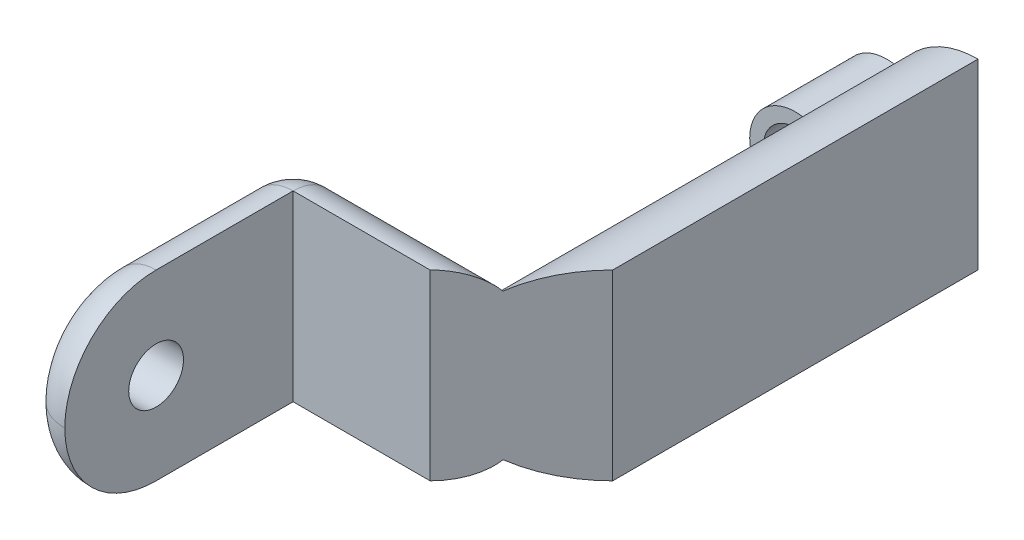
ISO-10303-21;
HEADER;
FILE_DESCRIPTION(('STEP AP214'),'2;1');
FILE_NAME('part.step','',(''),(''),'','','');
FILE_SCHEMA(('AUTOMOTIVE_DESIGN { 1 0 10303 214 1 1 1 1 }'));
ENDSEC;
DATA;
#1=APPLICATION_CONTEXT('core data for automotive mechanical design processes');
#2=APPLICATION_PROTOCOL_DEFINITION('international standard','automotive_design',2000,#1);
#3=PRODUCT_CONTEXT('',#1,'mechanical');
#4=PRODUCT('Part','Part','',(#3));
#5=PRODUCT_RELATED_PRODUCT_CATEGORY('part','',(#4));
#6=PRODUCT_DEFINITION_FORMATION('','',#4);
#7=PRODUCT_DEFINITION_CONTEXT('part definition',#1,'design');
#8=PRODUCT_DEFINITION('design','',#6,#7);
#9=PRODUCT_DEFINITION_SHAPE('','',#8);
#10=(LENGTH_UNIT() NAMED_UNIT(*) SI_UNIT(.MILLI.,.METRE.));
#11=(NAMED_UNIT(*) PLANE_ANGLE_UNIT() SI_UNIT($,.RADIAN.));
#12=(NAMED_UNIT(*) SI_UNIT($,.STERADIAN.) SOLID_ANGLE_UNIT());
#13=UNCERTAINTY_MEASURE_WITH_UNIT(LENGTH_MEASURE(1.E-05),#10,'distance_accuracy_value','');
#14=(GEOMETRIC_REPRESENTATION_CONTEXT(3) GLOBAL_UNCERTAINTY_ASSIGNED_CONTEXT((#13)) GLOBAL_UNIT_ASSIGNED_CONTEXT((#10,
#11,#12)) REPRESENTATION_CONTEXT('',''));
#15=CARTESIAN_POINT('',(0.,0.,0.));
#16=DIRECTION('',(0.,0.,1.));
#17=DIRECTION('',(1.,0.,0.));
#18=AXIS2_PLACEMENT_3D('',#15,#16,#17);
#19=CARTESIAN_POINT('',(10.,0.,-5.));
#20=DIRECTION('',(0.,0.,1.));
#21=DIRECTION('',(1.,0.,0.));
#22=AXIS2_PLACEMENT_3D('',#19,#20,#21);
#23=CYLINDRICAL_SURFACE('',#22,10.);
#24=DIRECTION('',(0.,0.,1.));
#25=VECTOR('',#24,1.);
#26=CARTESIAN_POINT('',(10.,-10.,-5.));
#27=LINE('',#26,#25);
#28=CARTESIAN_POINT('',(10.,-10.,-5.));
#29=VERTEX_POINT('',#28);
#30=CARTESIAN_POINT('',(10.,-10.,34.9999999999999));
#31=VERTEX_POINT('',#30);
#32=EDGE_CURVE('E178',#29,#31,#27,.T.);
#33=ORIENTED_EDGE('',*,*,#32,.T.);
#34=CARTESIAN_POINT('',(10.,0.,34.9999999999999));
#35=DIRECTION('',(0.707106781186549,0.,0.707106781186546));
#36=DIRECTION('',(-0.707106781186546,0.,0.707106781186549));
#37=AXIS2_PLACEMENT_3D('',#34,#35,#36);
#38=ELLIPSE('',#37,14.142135623731,10.);
#39=CARTESIAN_POINT('',(3.99999999999997,-7.99999999999997,41.));
#40=VERTEX_POINT('',#39);
#41=EDGE_CURVE('E46',#31,#40,#38,.F.);
#42=ORIENTED_EDGE('',*,*,#41,.T.);
#43=CARTESIAN_POINT('',(1.33974596215561,-5.,40.));
#44=CARTESIAN_POINT('',(1.3937879925422,-5.09360980398478,40.0000002829008));
#45=CARTESIAN_POINT('',(1.44933704504794,-5.18631126444913,40.0026288745514));
#46=CARTESIAN_POINT('',(1.5632598676786,-5.36964138602988,40.012837252933));
#47=CARTESIAN_POINT('',(1.62163264250084,-5.46027076116266,40.0204153066888));
#48=CARTESIAN_POINT('',(1.80043301912905,-5.72827244038871,40.0500643550123));
#49=CARTESIAN_POINT('',(1.92484145612804,-5.9022749609317,40.0790536521328));
#50=CARTESIAN_POINT('',(2.18095556524424,-6.23750749833118,40.1525618576713));
#51=CARTESIAN_POINT('',(2.31254275449186,-6.39887616636793,40.1968699815399));
#52=CARTESIAN_POINT('',(2.58327859913518,-6.71080679877306,40.2989271645852));
#53=CARTESIAN_POINT('',(2.72243275962746,-6.86136070529855,40.356686112509));
#54=CARTESIAN_POINT('',(3.03411171534371,-7.17877699663914,40.4957352209033));
#55=CARTESIAN_POINT('',(3.20795141312213,-7.34329869368486,40.5794113795357));
#56=CARTESIAN_POINT('',(3.5628582648149,-7.65631874892635,40.7601137242358));
#57=CARTESIAN_POINT('',(3.74392557332209,-7.80481676413645,40.8571401959647));
#58=CARTESIAN_POINT('',(4.11296705846482,-8.08684599120278,41.0627415552706));
#59=CARTESIAN_POINT('',(4.30097429057302,-8.2202885435333,41.1713781898031));
#60=CARTESIAN_POINT('',(4.68183469868983,-8.47167066572253,41.3977617022044));
#61=CARTESIAN_POINT('',(4.87468927544142,-8.58960569155025,41.5155112343589));
#62=CARTESIAN_POINT('',(5.34326406181711,-8.85515863225533,41.8076692204953));
#63=CARTESIAN_POINT('',(5.620897636726,-8.99544103951293,41.9857031510398));
#64=CARTESIAN_POINT('',(6.18187355818818,-9.24751486022698,42.3527000735922));
#65=CARTESIAN_POINT('',(6.46521840552304,-9.35929348694011,42.5416679240638));
#66=CARTESIAN_POINT('',(7.03552207440247,-9.55524129246284,42.9272097213761));
#67=CARTESIAN_POINT('',(7.32247480990701,-9.63945180221382,43.1237717834615));
#68=CARTESIAN_POINT('',(7.89901450822322,-9.78130605332881,43.5222274057551));
#69=CARTESIAN_POINT('',(8.18860028194732,-9.8389612332895,43.7241186307512));
#70=CARTESIAN_POINT('',(8.72909183787992,-9.92213794549857,44.1029157974057));
#71=CARTESIAN_POINT('',(8.97978824870865,-9.95100854953136,44.2794008009864));
#72=CARTESIAN_POINT('',(9.48156738398789,-9.98971795720525,44.6334209377073));
#73=CARTESIAN_POINT('',(9.73264942143891,-9.99957681570153,44.8109547658957));
#74=CARTESIAN_POINT('',(9.98911340789319,-9.9999955542052,44.9923020170791));
#75=CARTESIAN_POINT('',(9.99455672035061,-9.99999999852913,44.9961510202373));
#76=CARTESIAN_POINT('',(10.,-10.,45.));
#77=B_SPLINE_CURVE_WITH_KNOTS('',3,(#43,#44,#45,#46,#47,#48,#49,#50,#51,#52,#53,#54,#55,#56,#57,
#58,#59,#60,#61,#62,#63,#64,#65,#66,#67,#68,#69,#70,#71,#72,#73,#74,#75,#76),.UNSPECIFIED.,.F.,
.F.,(4,2,2,2,2,2,2,2,2,2,2,2,2,2,2,2,4),(0.,0.324164501699147,0.648215563169963,
1.29453690515215,1.9322973539422,2.57052815854178,3.33008992767272,4.08966795194081,
4.85350822338373,5.61757181965429,6.69122947966725,7.76536793656894,8.83788855857111,
9.90994676377595,10.8332249647611,11.7555286965104,11.7755287009549),.UNSPECIFIED.);
#78=CARTESIAN_POINT('',(1.33974596215561,-5.,40.));
#79=VERTEX_POINT('',#78);
#80=EDGE_CURVE('E267',#40,#79,#77,.F.);
#81=ORIENTED_EDGE('',*,*,#80,.T.);
#82=CARTESIAN_POINT('',(10.,0.,40.));
#83=DIRECTION('',(0.,0.,1.));
#84=DIRECTION('',(1.,0.,0.));
#85=AXIS2_PLACEMENT_3D('',#82,#83,#84);
#86=CIRCLE('',#85,10.);
#87=CARTESIAN_POINT('',(1.25,-4.84122918275927,40.));
#88=VERTEX_POINT('',#87);
#89=EDGE_CURVE('E166',#88,#79,#86,.T.);
#90=ORIENTED_EDGE('',*,*,#89,.F.);
#91=DIRECTION('',(0.,0.,-1.));
#92=VECTOR('',#91,1.);
#93=CARTESIAN_POINT('',(1.25,-4.84122918275927,22.5));
#94=LINE('',#93,#92);
#95=CARTESIAN_POINT('',(1.25,-4.84122918275927,5.));
#96=VERTEX_POINT('',#95);
#97=EDGE_CURVE('E145',#88,#96,#94,.T.);
#98=ORIENTED_EDGE('',*,*,#97,.T.);
#99=DIRECTION('',(0.,0.,1.));
#100=VECTOR('',#99,1.);
#101=CARTESIAN_POINT('',(1.25,-4.84122918275927,0.));
#102=LINE('',#101,#100);
#103=CARTESIAN_POINT('',(1.25,-4.84122918275927,-5.));
#104=VERTEX_POINT('',#103);
#105=EDGE_CURVE('E181',#96,#104,#102,.F.);
#106=ORIENTED_EDGE('',*,*,#105,.T.);
#107=CARTESIAN_POINT('',(10.,0.,-5.));
#108=DIRECTION('',(0.,0.,1.));
#109=DIRECTION('',(1.,0.,0.));
#110=AXIS2_PLACEMENT_3D('',#107,#108,#109);
#111=CIRCLE('',#110,10.);
#112=EDGE_CURVE('E165',#104,#29,#111,.T.);
#113=ORIENTED_EDGE('',*,*,#112,.T.);
#114=EDGE_LOOP('',(#33,#42,#81,#90,#98,#106,#113));
#115=FACE_BOUND('',#114,.T.);
#116=ADVANCED_FACE('F38',(#115),#23,.T.);
#117=CARTESIAN_POINT('',(1.33974596215561,5.,40.));
#118=CARTESIAN_POINT('',(1.3937879925422,5.09360980398478,40.0000002829008));
#119=CARTESIAN_POINT('',(1.44933704504795,5.18631126444914,40.0026288745514));
#120=CARTESIAN_POINT('',(1.56325986767861,5.36964138602989,40.012837252933));
#121=CARTESIAN_POINT('',(1.62163264250085,5.46027076116268,40.0204153066888));
#122=CARTESIAN_POINT('',(1.80043301912907,5.72827244038874,40.0500643550123));
#123=CARTESIAN_POINT('',(1.92484145612806,5.90227496093173,40.0790536521328));
#124=CARTESIAN_POINT('',(2.18095556524426,6.23750749833121,40.1525618576713));
#125=CARTESIAN_POINT('',(2.31254275449188,6.39887616636795,40.1968699815399));
#126=CARTESIAN_POINT('',(2.58327859913519,6.71080679877307,40.2989271645852));
#127=CARTESIAN_POINT('',(2.72243275962747,6.86136070529856,40.356686112509));
#128=CARTESIAN_POINT('',(3.0341117153437,7.17877699663914,40.4957352209033));
#129=CARTESIAN_POINT('',(3.20795141312212,7.34329869368485,40.5794113795357));
#130=CARTESIAN_POINT('',(3.56285826481488,7.65631874892633,40.7601137242358));
#131=CARTESIAN_POINT('',(3.74392557332206,7.80481676413643,40.8571401959647));
#132=CARTESIAN_POINT('',(4.11296705846479,8.08684599120276,41.0627415552706));
#133=CARTESIAN_POINT('',(4.300974290573,8.22028854353329,41.171378189803));
#134=CARTESIAN_POINT('',(4.68183469868982,8.47167066572252,41.3977617022044));
#135=CARTESIAN_POINT('',(4.87468927544141,8.58960569155025,41.5155112343589));
#136=CARTESIAN_POINT('',(5.34326406181711,8.85515863225533,41.8076692204953));
#137=CARTESIAN_POINT('',(5.620897636726,8.99544103951294,41.9857031510398));
#138=CARTESIAN_POINT('',(6.18187355818819,9.24751486022699,42.3527000735922));
#139=CARTESIAN_POINT('',(6.46521840552305,9.35929348694011,42.5416679240639));
#140=CARTESIAN_POINT('',(7.03552207440249,9.55524129246285,42.9272097213761));
#141=CARTESIAN_POINT('',(7.32247480990704,9.63945180221383,43.1237717834614));
#142=CARTESIAN_POINT('',(7.89901450822319,9.78130605332881,43.5222274057551));
#143=CARTESIAN_POINT('',(8.18860028194722,9.8389612332895,43.7241186307514));
#144=CARTESIAN_POINT('',(8.72909183788,9.92213794549857,44.1029157974056));
#145=CARTESIAN_POINT('',(8.97978824870896,9.95100854953136,44.279400800986));
#146=CARTESIAN_POINT('',(9.48156738398755,9.98971795720525,44.6334209377078));
#147=CARTESIAN_POINT('',(9.73264942143771,9.99957681570153,44.8109547658974));
#148=CARTESIAN_POINT('',(9.98911340789313,9.9999955542052,44.9923020170791));
#149=CARTESIAN_POINT('',(9.99455672035058,9.99999999852913,44.9961510202373));
#150=CARTESIAN_POINT('',(10.,10.,45.));
#151=B_SPLINE_CURVE_WITH_KNOTS('',3,(#117,#118,#119,#120,#121,#122,#123,#124,#125,#126,#127,
#128,#129,#130,#131,#132,#133,#134,#135,#136,#137,#138,#139,#140,#141,#142,#143,#144,#145,#146,
#147,#148,#149,#150),.UNSPECIFIED.,.F.,.F.,(4,2,2,2,2,2,2,2,2,2,2,2,2,2,2,2,4),(0.,
0.324164501699159,0.648215563169988,1.2945369051522,1.93229735394222,2.57052815854178,
3.3300899276727,4.08966795194077,4.85350822338371,5.61757181965429,6.69122947966726,
7.76536793656896,8.83788855857112,9.90994676377595,10.8332249647611,11.7555286965104,
11.7755287009549),.UNSPECIFIED.);
#152=CARTESIAN_POINT('',(1.33974596215561,5.,40.));
#153=VERTEX_POINT('',#152);
#154=CARTESIAN_POINT('',(3.99999999999997,7.99999999999997,41.));
#155=VERTEX_POINT('',#154);
#156=EDGE_CURVE('E260',#153,#155,#151,.T.);
#157=ORIENTED_EDGE('',*,*,#156,.T.);
#158=CARTESIAN_POINT('',(10.,0.,34.9999999999999));
#159=DIRECTION('',(0.707106781186549,0.,0.707106781186546));
#160=DIRECTION('',(-0.707106781186546,0.,0.707106781186549));
#161=AXIS2_PLACEMENT_3D('',#158,#159,#160);
#162=ELLIPSE('',#161,14.142135623731,10.);
#163=CARTESIAN_POINT('',(10.,10.,34.9999999999999));
#164=VERTEX_POINT('',#163);
#165=EDGE_CURVE('E351',#155,#164,#162,.F.);
#166=ORIENTED_EDGE('',*,*,#165,.T.);
#167=DIRECTION('',(0.,0.,1.));
#168=VECTOR('',#167,1.);
#169=CARTESIAN_POINT('',(10.,10.,-5.));
#170=LINE('',#169,#168);
#171=CARTESIAN_POINT('',(10.,10.,-5.));
#172=VERTEX_POINT('',#171);
#173=EDGE_CURVE('E179',#172,#164,#170,.T.);
#174=ORIENTED_EDGE('',*,*,#173,.F.);
#175=CARTESIAN_POINT('',(1.25,4.84122918275927,-5.));
#176=VERTEX_POINT('',#175);
#177=EDGE_CURVE('E168',#172,#176,#111,.T.);
#178=ORIENTED_EDGE('',*,*,#177,.T.);
#179=DIRECTION('',(0.,0.,1.));
#180=VECTOR('',#179,1.);
#181=CARTESIAN_POINT('',(1.25,4.84122918275927,0.));
#182=LINE('',#181,#180);
#183=CARTESIAN_POINT('',(1.25,4.84122918275927,5.));
#184=VERTEX_POINT('',#183);
#185=EDGE_CURVE('E159',#176,#184,#182,.T.);
#186=ORIENTED_EDGE('',*,*,#185,.T.);
#187=DIRECTION('',(0.,0.,-1.));
#188=VECTOR('',#187,1.);
#189=CARTESIAN_POINT('',(1.25,4.84122918275927,22.5));
#190=LINE('',#189,#188);
#191=CARTESIAN_POINT('',(1.25,4.84122918275927,40.));
#192=VERTEX_POINT('',#191);
#193=EDGE_CURVE('E142',#184,#192,#190,.F.);
#194=ORIENTED_EDGE('',*,*,#193,.T.);
#195=EDGE_CURVE('E157',#153,#192,#86,.T.);
#196=ORIENTED_EDGE('',*,*,#195,.F.);
#197=EDGE_LOOP('',(#157,#166,#174,#178,#186,#194,#196));
#198=FACE_BOUND('',#197,.T.);
#199=ADVANCED_FACE('F156',(#198),#23,.T.);
#200=CARTESIAN_POINT('',(-20.,0.,45.));
#201=DIRECTION('',(0.,0.,-1.));
#202=DIRECTION('',(-1.,0.,0.));
#203=AXIS2_PLACEMENT_3D('',#200,#201,#202);
#204=PLANE('',#203);
#205=DIRECTION('',(1.,0.,0.));
#206=VECTOR('',#205,1.);
#207=CARTESIAN_POINT('',(-20.,-10.,45.));
#208=LINE('',#207,#206);
#209=CARTESIAN_POINT('',(-15.,-10.,45.));
#210=VERTEX_POINT('',#209);
#211=CARTESIAN_POINT('',(0.,-10.,45.));
#212=VERTEX_POINT('',#211);
#213=EDGE_CURVE('E200',#210,#212,#208,.T.);
#214=ORIENTED_EDGE('',*,*,#213,.T.);
#215=DIRECTION('',(0.,1.,0.));
#216=VECTOR('',#215,1.);
#217=CARTESIAN_POINT('',(0.,10.,45.));
#218=LINE('',#217,#216);
#219=CARTESIAN_POINT('',(0.,10.,45.));
#220=VERTEX_POINT('',#219);
#221=EDGE_CURVE('E346',#212,#220,#218,.T.);
#222=ORIENTED_EDGE('',*,*,#221,.T.);
#223=DIRECTION('',(1.,0.,0.));
#224=VECTOR('',#223,1.);
#225=CARTESIAN_POINT('',(-20.,10.,45.));
#226=LINE('',#225,#224);
#227=CARTESIAN_POINT('',(-15.,10.,45.));
#228=VERTEX_POINT('',#227);
#229=EDGE_CURVE('E170',#228,#220,#226,.T.);
#230=ORIENTED_EDGE('',*,*,#229,.F.);
#231=DIRECTION('',(0.,1.,0.));
#232=VECTOR('',#231,1.);
#233=CARTESIAN_POINT('',(-15.,-10.,45.));
#234=LINE('',#233,#232);
#235=EDGE_CURVE('E208',#210,#228,#234,.T.);
#236=ORIENTED_EDGE('',*,*,#235,.F.);
#237=EDGE_LOOP('',(#214,#222,#230,#236));
#238=FACE_BOUND('',#237,.T.);
#239=ADVANCED_FACE('F295',(#238),#204,.F.);
#240=CARTESIAN_POINT('',(0.,0.,-5.));
#241=DIRECTION('',(0.,0.,1.));
#242=DIRECTION('',(1.,0.,0.));
#243=AXIS2_PLACEMENT_3D('',#240,#241,#242);
#244=PLANE('',#243);
#245=CARTESIAN_POINT('',(0.,0.,-5.));
#246=DIRECTION('',(0.,0.,1.));
#247=DIRECTION('',(1.,0.,0.));
#248=AXIS2_PLACEMENT_3D('',#245,#246,#247);
#249=CIRCLE('',#248,5.);
#250=EDGE_CURVE('E195',#176,#104,#249,.T.);
#251=ORIENTED_EDGE('',*,*,#250,.F.);
#252=ORIENTED_EDGE('',*,*,#177,.F.);
#253=DIRECTION('',(0.,1.,0.));
#254=VECTOR('',#253,1.);
#255=CARTESIAN_POINT('',(10.,-10.,-5.));
#256=LINE('',#255,#254);
#257=EDGE_CURVE('E175',#29,#172,#256,.T.);
#258=ORIENTED_EDGE('',*,*,#257,.F.);
#259=ORIENTED_EDGE('',*,*,#112,.F.);
#260=EDGE_LOOP('',(#251,#252,#258,#259));
#261=FACE_BOUND('',#260,.T.);
#262=CARTESIAN_POINT('',(0.,0.,-5.));
#263=DIRECTION('',(0.,0.,1.));
#264=DIRECTION('',(1.,0.,0.));
#265=AXIS2_PLACEMENT_3D('',#262,#263,#264);
#266=CIRCLE('',#265,3.5);
#267=CARTESIAN_POINT('',(3.5,0.,-5.));
#268=VERTEX_POINT('',#267);
#269=EDGE_CURVE('E192',#268,#268,#266,.T.);
#270=ORIENTED_EDGE('',*,*,#269,.T.);
#271=EDGE_LOOP('',(#270));
#272=FACE_BOUND('',#271,.T.);
#273=ADVANCED_FACE('F292',(#261,#272),#244,.F.);
#274=CARTESIAN_POINT('',(0.,0.,-5.));
#275=DIRECTION('',(0.,0.,1.));
#276=DIRECTION('',(1.,0.,0.));
#277=AXIS2_PLACEMENT_3D('',#274,#275,#276);
#278=CYLINDRICAL_SURFACE('',#277,5.);
#279=ORIENTED_EDGE('',*,*,#185,.F.);
#280=ORIENTED_EDGE('',*,*,#250,.T.);
#281=ORIENTED_EDGE('',*,*,#105,.F.);
#282=CARTESIAN_POINT('',(0.,0.,5.));
#283=DIRECTION('',(0.,0.,1.));
#284=DIRECTION('',(1.,0.,0.));
#285=AXIS2_PLACEMENT_3D('',#282,#283,#284);
#286=CIRCLE('',#285,5.);
#287=EDGE_CURVE('E189',#184,#96,#286,.T.);
#288=ORIENTED_EDGE('',*,*,#287,.F.);
#289=EDGE_LOOP('',(#279,#280,#281,#288));
#290=FACE_BOUND('',#289,.T.);
#291=ADVANCED_FACE('F290',(#290),#278,.T.);
#292=CARTESIAN_POINT('',(0.,0.,-5.));
#293=DIRECTION('',(0.,0.,1.));
#294=DIRECTION('',(1.,0.,0.));
#295=AXIS2_PLACEMENT_3D('',#292,#293,#294);
#296=CYLINDRICAL_SURFACE('',#295,3.5);
#297=ORIENTED_EDGE('',*,*,#269,.F.);
#298=EDGE_LOOP('',(#297));
#299=FACE_BOUND('',#298,.T.);
#300=CARTESIAN_POINT('',(0.,0.,5.));
#301=DIRECTION('',(0.,0.,1.));
#302=DIRECTION('',(1.,0.,0.));
#303=AXIS2_PLACEMENT_3D('',#300,#301,#302);
#304=CIRCLE('',#303,3.5);
#305=CARTESIAN_POINT('',(3.5,0.,5.));
#306=VERTEX_POINT('',#305);
#307=EDGE_CURVE('E186',#306,#306,#304,.T.);
#308=ORIENTED_EDGE('',*,*,#307,.T.);
#309=EDGE_LOOP('',(#308));
#310=FACE_BOUND('',#309,.T.);
#311=ADVANCED_FACE('F286',(#299,#310),#296,.F.);
#312=CARTESIAN_POINT('',(0.,0.,5.));
#313=DIRECTION('',(0.,0.,1.));
#314=DIRECTION('',(1.,0.,0.));
#315=AXIS2_PLACEMENT_3D('',#312,#313,#314);
#316=PLANE('',#315);
#317=ORIENTED_EDGE('',*,*,#287,.T.);
#318=CARTESIAN_POINT('',(0.,0.,5.));
#319=DIRECTION('',(0.,0.,1.));
#320=DIRECTION('',(1.,0.,0.));
#321=AXIS2_PLACEMENT_3D('',#318,#319,#320);
#322=CIRCLE('',#321,5.);
#323=EDGE_CURVE('E150',#96,#184,#322,.T.);
#324=ORIENTED_EDGE('',*,*,#323,.T.);
#325=EDGE_LOOP('',(#317,#324));
#326=FACE_BOUND('',#325,.T.);
#327=ORIENTED_EDGE('',*,*,#307,.F.);
#328=EDGE_LOOP('',(#327));
#329=FACE_BOUND('',#328,.T.);
#330=ADVANCED_FACE('F282',(#326,#329),#316,.T.);
#331=CARTESIAN_POINT('',(10.,-10.,-5.));
#332=DIRECTION('',(1.,0.,0.));
#333=DIRECTION('',(0.,0.,-1.));
#334=AXIS2_PLACEMENT_3D('',#331,#332,#333);
#335=PLANE('',#334);
#336=ORIENTED_EDGE('',*,*,#173,.T.);
#337=DIRECTION('',(0.,-1.,0.));
#338=VECTOR('',#337,1.);
#339=CARTESIAN_POINT('',(10.,-10.,34.9999999999999));
#340=LINE('',#339,#338);
#341=EDGE_CURVE('E60',#164,#31,#340,.T.);
#342=ORIENTED_EDGE('',*,*,#341,.T.);
#343=ORIENTED_EDGE('',*,*,#32,.F.);
#344=ORIENTED_EDGE('',*,*,#257,.T.);
#345=EDGE_LOOP('',(#336,#342,#343,#344));
#346=FACE_BOUND('',#345,.T.);
#347=ADVANCED_FACE('F280',(#346),#335,.T.);
#348=CARTESIAN_POINT('',(-20.,0.,40.));
#349=DIRECTION('',(0.,0.,1.));
#350=DIRECTION('',(1.,0.,0.));
#351=AXIS2_PLACEMENT_3D('',#348,#349,#350);
#352=PLANE('',#351);
#353=ORIENTED_EDGE('',*,*,#195,.T.);
#354=CARTESIAN_POINT('',(0.,0.,40.));
#355=DIRECTION('',(0.,0.,1.));
#356=DIRECTION('',(1.,0.,0.));
#357=AXIS2_PLACEMENT_3D('',#354,#355,#356);
#358=CIRCLE('',#357,5.);
#359=EDGE_CURVE('E139',#88,#192,#358,.T.);
#360=ORIENTED_EDGE('',*,*,#359,.F.);
#361=ORIENTED_EDGE('',*,*,#89,.T.);
#362=DIRECTION('',(1.,0.,0.));
#363=VECTOR('',#362,1.);
#364=CARTESIAN_POINT('',(-20.,-5.,40.));
#365=LINE('',#364,#363);
#366=CARTESIAN_POINT('',(-15.,-5.,40.));
#367=VERTEX_POINT('',#366);
#368=EDGE_CURVE('E247',#79,#367,#365,.F.);
#369=ORIENTED_EDGE('',*,*,#368,.T.);
#370=DIRECTION('',(0.,-1.,0.));
#371=VECTOR('',#370,1.);
#372=CARTESIAN_POINT('',(-15.,0.,40.));
#373=LINE('',#372,#371);
#374=CARTESIAN_POINT('',(-15.,5.,40.));
#375=VERTEX_POINT('',#374);
#376=EDGE_CURVE('E235',#367,#375,#373,.F.);
#377=ORIENTED_EDGE('',*,*,#376,.T.);
#378=DIRECTION('',(1.,0.,0.));
#379=VECTOR('',#378,1.);
#380=CARTESIAN_POINT('',(10.,5.,40.));
#381=LINE('',#380,#379);
#382=EDGE_CURVE('E163',#375,#153,#381,.T.);
#383=ORIENTED_EDGE('',*,*,#382,.T.);
#384=EDGE_LOOP('',(#353,#360,#361,#369,#377,#383));
#385=FACE_BOUND('',#384,.T.);
#386=ADVANCED_FACE('F161',(#385),#352,.F.);
#387=CARTESIAN_POINT('',(-20.,0.,0.));
#388=DIRECTION('',(1.,0.,0.));
#389=DIRECTION('',(0.,0.,-1.));
#390=AXIS2_PLACEMENT_3D('',#387,#388,#389);
#391=PLANE('',#390);
#392=CARTESIAN_POINT('',(-20.,0.,60.));
#393=DIRECTION('',(-1.,0.,0.));
#394=DIRECTION('',(0.,0.,1.));
#395=AXIS2_PLACEMENT_3D('',#392,#393,#394);
#396=CIRCLE('',#395,3.00000000000002);
#397=CARTESIAN_POINT('',(-20.,0.,63.));
#398=VERTEX_POINT('',#397);
#399=EDGE_CURVE('E206',#398,#398,#396,.T.);
#400=ORIENTED_EDGE('',*,*,#399,.F.);
#401=EDGE_LOOP('',(#400));
#402=FACE_BOUND('',#401,.T.);
#403=DIRECTION('',(0.,0.,1.));
#404=VECTOR('',#403,1.);
#405=CARTESIAN_POINT('',(-20.,5.,40.));
#406=LINE('',#405,#404);
#407=CARTESIAN_POINT('',(-20.,5.,60.));
#408=VERTEX_POINT('',#407);
#409=CARTESIAN_POINT('',(-20.,5.,45.));
#410=VERTEX_POINT('',#409);
#411=EDGE_CURVE('E226',#408,#410,#406,.F.);
#412=ORIENTED_EDGE('',*,*,#411,.T.);
#413=DIRECTION('',(0.,-1.,0.));
#414=VECTOR('',#413,1.);
#415=CARTESIAN_POINT('',(-20.,0.,45.));
#416=LINE('',#415,#414);
#417=CARTESIAN_POINT('',(-20.,-5.,45.));
#418=VERTEX_POINT('',#417);
#419=EDGE_CURVE('E256',#410,#418,#416,.T.);
#420=ORIENTED_EDGE('',*,*,#419,.T.);
#421=DIRECTION('',(0.,0.,1.));
#422=VECTOR('',#421,1.);
#423=CARTESIAN_POINT('',(-20.,-4.99999999999999,0.));
#424=LINE('',#423,#422);
#425=CARTESIAN_POINT('',(-20.,-5.,60.));
#426=VERTEX_POINT('',#425);
#427=EDGE_CURVE('E233',#418,#426,#424,.T.);
#428=ORIENTED_EDGE('',*,*,#427,.T.);
#429=CARTESIAN_POINT('',(-20.,0.,60.));
#430=DIRECTION('',(1.,0.,0.));
#431=DIRECTION('',(0.,0.,-1.));
#432=AXIS2_PLACEMENT_3D('',#429,#430,#431);
#433=CIRCLE('',#432,5.);
#434=CARTESIAN_POINT('',(-20.,0.,65.));
#435=VERTEX_POINT('',#434);
#436=EDGE_CURVE('E231',#426,#435,#433,.F.);
#437=ORIENTED_EDGE('',*,*,#436,.T.);
#438=CARTESIAN_POINT('',(-20.,0.,60.));
#439=DIRECTION('',(1.,0.,0.));
#440=DIRECTION('',(0.,0.,-1.));
#441=AXIS2_PLACEMENT_3D('',#438,#439,#440);
#442=CIRCLE('',#441,5.);
#443=EDGE_CURVE('E229',#435,#408,#442,.F.);
#444=ORIENTED_EDGE('',*,*,#443,.T.);
#445=EDGE_LOOP('',(#412,#420,#428,#437,#444));
#446=FACE_BOUND('',#445,.T.);
#447=ADVANCED_FACE('F375',(#402,#446),#391,.F.);
#448=CARTESIAN_POINT('',(-15.,-10.,70.));
#449=DIRECTION('',(-1.,0.,0.));
#450=DIRECTION('',(0.,0.,1.));
#451=AXIS2_PLACEMENT_3D('',#448,#449,#450);
#452=PLANE('',#451);
#453=CARTESIAN_POINT('',(-15.,0.,60.));
#454=DIRECTION('',(-1.,0.,0.));
#455=DIRECTION('',(0.,0.,1.));
#456=AXIS2_PLACEMENT_3D('',#453,#454,#455);
#457=CIRCLE('',#456,3.00000000000002);
#458=CARTESIAN_POINT('',(-15.,0.,63.));
#459=VERTEX_POINT('',#458);
#460=EDGE_CURVE('E212',#459,#459,#457,.T.);
#461=ORIENTED_EDGE('',*,*,#460,.T.);
#462=EDGE_LOOP('',(#461));
#463=FACE_BOUND('',#462,.T.);
#464=CARTESIAN_POINT('',(-15.,0.,60.));
#465=DIRECTION('',(-1.,0.,0.));
#466=DIRECTION('',(0.,0.,1.));
#467=AXIS2_PLACEMENT_3D('',#464,#465,#466);
#468=CIRCLE('',#467,10.);
#469=CARTESIAN_POINT('',(-15.,10.,60.));
#470=VERTEX_POINT('',#469);
#471=CARTESIAN_POINT('',(-15.,0.,70.));
#472=VERTEX_POINT('',#471);
#473=EDGE_CURVE('E197',#470,#472,#468,.F.);
#474=ORIENTED_EDGE('',*,*,#473,.T.);
#475=CARTESIAN_POINT('',(-15.,0.,60.));
#476=DIRECTION('',(-1.,0.,0.));
#477=DIRECTION('',(0.,0.,1.));
#478=AXIS2_PLACEMENT_3D('',#475,#476,#477);
#479=CIRCLE('',#478,10.);
#480=CARTESIAN_POINT('',(-15.,-10.,60.));
#481=VERTEX_POINT('',#480);
#482=EDGE_CURVE('E224',#472,#481,#479,.F.);
#483=ORIENTED_EDGE('',*,*,#482,.T.);
#484=DIRECTION('',(0.,0.,-1.));
#485=VECTOR('',#484,1.);
#486=CARTESIAN_POINT('',(-15.,-10.,70.));
#487=LINE('',#486,#485);
#488=EDGE_CURVE('E220',#481,#210,#487,.T.);
#489=ORIENTED_EDGE('',*,*,#488,.T.);
#490=ORIENTED_EDGE('',*,*,#235,.T.);
#491=DIRECTION('',(0.,0.,-1.));
#492=VECTOR('',#491,1.);
#493=CARTESIAN_POINT('',(-15.,10.,70.));
#494=LINE('',#493,#492);
#495=EDGE_CURVE('E211',#470,#228,#494,.T.);
#496=ORIENTED_EDGE('',*,*,#495,.F.);
#497=EDGE_LOOP('',(#474,#483,#489,#490,#496));
#498=FACE_BOUND('',#497,.T.);
#499=ADVANCED_FACE('F319',(#463,#498),#452,.F.);
#500=CARTESIAN_POINT('',(-14.,0.,60.));
#501=DIRECTION('',(-1.,0.,0.));
#502=DIRECTION('',(0.,0.,1.));
#503=AXIS2_PLACEMENT_3D('',#500,#501,#502);
#504=CYLINDRICAL_SURFACE('',#503,3.00000000000002);
#505=ORIENTED_EDGE('',*,*,#399,.T.);
#506=EDGE_LOOP('',(#505));
#507=FACE_BOUND('',#506,.T.);
#508=ORIENTED_EDGE('',*,*,#460,.F.);
#509=EDGE_LOOP('',(#508));
#510=FACE_BOUND('',#509,.T.);
#511=ADVANCED_FACE('F314',(#507,#510),#504,.F.);
#512=CARTESIAN_POINT('',(-15.,5.00000000000001,0.));
#513=DIRECTION('',(0.,0.,-1.));
#514=DIRECTION('',(0.,1.,0.));
#515=AXIS2_PLACEMENT_3D('',#512,#513,#514);
#516=CYLINDRICAL_SURFACE('',#515,5.);
#517=ORIENTED_EDGE('',*,*,#495,.T.);
#518=CARTESIAN_POINT('',(-15.,5.,45.));
#519=DIRECTION('',(0.,0.,-1.));
#520=DIRECTION('',(0.,1.,0.));
#521=AXIS2_PLACEMENT_3D('',#518,#519,#520);
#522=CIRCLE('',#521,5.);
#523=EDGE_CURVE('E250',#228,#410,#522,.F.);
#524=ORIENTED_EDGE('',*,*,#523,.T.);
#525=ORIENTED_EDGE('',*,*,#411,.F.);
#526=CARTESIAN_POINT('',(-15.,5.,60.));
#527=DIRECTION('',(0.,0.,1.));
#528=DIRECTION('',(1.,0.,0.));
#529=AXIS2_PLACEMENT_3D('',#526,#527,#528);
#530=CIRCLE('',#529,5.);
#531=EDGE_CURVE('E243',#470,#408,#530,.T.);
#532=ORIENTED_EDGE('',*,*,#531,.F.);
#533=EDGE_LOOP('',(#517,#524,#525,#532));
#534=FACE_BOUND('',#533,.T.);
#535=ADVANCED_FACE('F311',(#534),#516,.T.);
#536=CARTESIAN_POINT('',(-15.,0.,60.));
#537=DIRECTION('',(1.,0.,0.));
#538=DIRECTION('',(0.,0.,-1.));
#539=AXIS2_PLACEMENT_3D('',#536,#537,#538);
#540=DEGENERATE_TOROIDAL_SURFACE('',#539,5.,5.,.T.);
#541=ORIENTED_EDGE('',*,*,#531,.T.);
#542=ORIENTED_EDGE('',*,*,#443,.F.);
#543=CARTESIAN_POINT('',(-15.,0.,65.));
#544=DIRECTION('',(0.,-1.,0.));
#545=DIRECTION('',(0.,0.,-1.));
#546=AXIS2_PLACEMENT_3D('',#543,#544,#545);
#547=CIRCLE('',#546,5.);
#548=EDGE_CURVE('E239',#472,#435,#547,.T.);
#549=ORIENTED_EDGE('',*,*,#548,.F.);
#550=ORIENTED_EDGE('',*,*,#473,.F.);
#551=EDGE_LOOP('',(#541,#542,#549,#550));
#552=FACE_BOUND('',#551,.T.);
#553=ADVANCED_FACE('F308',(#552),#540,.T.);
#554=CARTESIAN_POINT('',(-15.,0.,60.));
#555=DIRECTION('',(1.,0.,0.));
#556=DIRECTION('',(0.,0.,-1.));
#557=AXIS2_PLACEMENT_3D('',#554,#555,#556);
#558=DEGENERATE_TOROIDAL_SURFACE('',#557,5.,5.,.T.);
#559=ORIENTED_EDGE('',*,*,#548,.T.);
#560=ORIENTED_EDGE('',*,*,#436,.F.);
#561=CARTESIAN_POINT('',(-15.,-5.,60.));
#562=DIRECTION('',(0.,0.,-1.));
#563=DIRECTION('',(-1.,0.,0.));
#564=AXIS2_PLACEMENT_3D('',#561,#562,#563);
#565=CIRCLE('',#564,5.);
#566=EDGE_CURVE('E236',#481,#426,#565,.T.);
#567=ORIENTED_EDGE('',*,*,#566,.F.);
#568=ORIENTED_EDGE('',*,*,#482,.F.);
#569=EDGE_LOOP('',(#559,#560,#567,#568));
#570=FACE_BOUND('',#569,.T.);
#571=ADVANCED_FACE('F304',(#570),#558,.T.);
#572=CARTESIAN_POINT('',(-15.,-4.99999999999999,0.));
#573=DIRECTION('',(0.,0.,1.));
#574=DIRECTION('',(0.,-1.,0.));
#575=AXIS2_PLACEMENT_3D('',#572,#573,#574);
#576=CYLINDRICAL_SURFACE('',#575,5.);
#577=ORIENTED_EDGE('',*,*,#427,.F.);
#578=CARTESIAN_POINT('',(-15.,-5.,45.));
#579=DIRECTION('',(0.,0.,1.));
#580=DIRECTION('',(0.,-1.,0.));
#581=AXIS2_PLACEMENT_3D('',#578,#579,#580);
#582=CIRCLE('',#581,5.);
#583=EDGE_CURVE('E252',#418,#210,#582,.T.);
#584=ORIENTED_EDGE('',*,*,#583,.T.);
#585=ORIENTED_EDGE('',*,*,#488,.F.);
#586=ORIENTED_EDGE('',*,*,#566,.T.);
#587=EDGE_LOOP('',(#577,#584,#585,#586));
#588=FACE_BOUND('',#587,.T.);
#589=ADVANCED_FACE('F300',(#588),#576,.T.);
#590=CARTESIAN_POINT('',(-20.,-5.,45.));
#591=DIRECTION('',(1.,0.,0.));
#592=DIRECTION('',(0.,0.,-1.));
#593=AXIS2_PLACEMENT_3D('',#590,#591,#592);
#594=CYLINDRICAL_SURFACE('',#593,5.);
#595=ORIENTED_EDGE('',*,*,#80,.F.);
#596=CARTESIAN_POINT('',(0.,-5.,45.));
#597=DIRECTION('',(0.707106781186549,0.,0.707106781186546));
#598=DIRECTION('',(0.707106781186546,0.,-0.707106781186549));
#599=AXIS2_PLACEMENT_3D('',#596,#597,#598);
#600=ELLIPSE('',#599,7.07106781186546,5.);
#601=EDGE_CURVE('E11',#40,#212,#600,.F.);
#602=ORIENTED_EDGE('',*,*,#601,.T.);
#603=ORIENTED_EDGE('',*,*,#213,.F.);
#604=CARTESIAN_POINT('',(-15.,-5.,45.));
#605=DIRECTION('',(-1.,0.,0.));
#606=DIRECTION('',(0.,0.,1.));
#607=AXIS2_PLACEMENT_3D('',#604,#605,#606);
#608=CIRCLE('',#607,5.);
#609=EDGE_CURVE('E240',#367,#210,#608,.T.);
#610=ORIENTED_EDGE('',*,*,#609,.F.);
#611=ORIENTED_EDGE('',*,*,#368,.F.);
#612=EDGE_LOOP('',(#595,#602,#603,#610,#611));
#613=FACE_BOUND('',#612,.T.);
#614=ADVANCED_FACE('F303',(#613),#594,.T.);
#615=CARTESIAN_POINT('',(-15.,-5.,45.));
#616=DIRECTION('',(0.,0.,1.));
#617=DIRECTION('',(1.,0.,0.));
#618=AXIS2_PLACEMENT_3D('',#615,#616,#617);
#619=SPHERICAL_SURFACE('',#618,5.);
#620=ORIENTED_EDGE('',*,*,#609,.T.);
#621=ORIENTED_EDGE('',*,*,#583,.F.);
#622=CARTESIAN_POINT('',(-15.,-5.,45.));
#623=DIRECTION('',(0.,1.,0.));
#624=DIRECTION('',(0.,0.,1.));
#625=AXIS2_PLACEMENT_3D('',#622,#623,#624);
#626=CIRCLE('',#625,5.);
#627=EDGE_CURVE('E337',#367,#418,#626,.T.);
#628=ORIENTED_EDGE('',*,*,#627,.F.);
#629=EDGE_LOOP('',(#620,#621,#628));
#630=FACE_BOUND('',#629,.T.);
#631=ADVANCED_FACE('F380',(#630),#619,.T.);
#632=CARTESIAN_POINT('',(-15.,0.,45.));
#633=DIRECTION('',(0.,-1.,0.));
#634=DIRECTION('',(0.,0.,-1.));
#635=AXIS2_PLACEMENT_3D('',#632,#633,#634);
#636=CYLINDRICAL_SURFACE('',#635,5.);
#637=ORIENTED_EDGE('',*,*,#627,.T.);
#638=ORIENTED_EDGE('',*,*,#419,.F.);
#639=CARTESIAN_POINT('',(-15.,5.,45.));
#640=DIRECTION('',(0.,1.,0.));
#641=DIRECTION('',(0.,0.,1.));
#642=AXIS2_PLACEMENT_3D('',#639,#640,#641);
#643=CIRCLE('',#642,5.);
#644=EDGE_CURVE('E334',#375,#410,#643,.T.);
#645=ORIENTED_EDGE('',*,*,#644,.F.);
#646=ORIENTED_EDGE('',*,*,#376,.F.);
#647=EDGE_LOOP('',(#637,#638,#645,#646));
#648=FACE_BOUND('',#647,.T.);
#649=ADVANCED_FACE('F383',(#648),#636,.T.);
#650=CARTESIAN_POINT('',(-15.,5.,45.));
#651=DIRECTION('',(0.,0.,1.));
#652=DIRECTION('',(1.,0.,0.));
#653=AXIS2_PLACEMENT_3D('',#650,#651,#652);
#654=SPHERICAL_SURFACE('',#653,5.);
#655=ORIENTED_EDGE('',*,*,#644,.T.);
#656=ORIENTED_EDGE('',*,*,#523,.F.);
#657=CARTESIAN_POINT('',(-15.,5.,45.));
#658=DIRECTION('',(1.,0.,0.));
#659=DIRECTION('',(0.,0.,-1.));
#660=AXIS2_PLACEMENT_3D('',#657,#658,#659);
#661=CIRCLE('',#660,5.);
#662=EDGE_CURVE('E332',#375,#228,#661,.T.);
#663=ORIENTED_EDGE('',*,*,#662,.F.);
#664=EDGE_LOOP('',(#655,#656,#663));
#665=FACE_BOUND('',#664,.T.);
#666=ADVANCED_FACE('F331',(#665),#654,.T.);
#667=CARTESIAN_POINT('',(-20.,5.,45.));
#668=DIRECTION('',(-1.,0.,0.));
#669=DIRECTION('',(0.,0.,1.));
#670=AXIS2_PLACEMENT_3D('',#667,#668,#669);
#671=CYLINDRICAL_SURFACE('',#670,5.);
#672=ORIENTED_EDGE('',*,*,#229,.T.);
#673=CARTESIAN_POINT('',(0.,5.,45.));
#674=DIRECTION('',(0.707106781186549,0.,0.707106781186546));
#675=DIRECTION('',(-0.707106781186546,0.,0.707106781186549));
#676=AXIS2_PLACEMENT_3D('',#673,#674,#675);
#677=ELLIPSE('',#676,7.07106781186546,5.);
#678=EDGE_CURVE('E349',#220,#155,#677,.F.);
#679=ORIENTED_EDGE('',*,*,#678,.T.);
#680=ORIENTED_EDGE('',*,*,#156,.F.);
#681=ORIENTED_EDGE('',*,*,#382,.F.);
#682=ORIENTED_EDGE('',*,*,#662,.T.);
#683=EDGE_LOOP('',(#672,#679,#680,#681,#682));
#684=FACE_BOUND('',#683,.T.);
#685=ADVANCED_FACE('F272',(#684),#671,.T.);
#686=CARTESIAN_POINT('',(0.,0.,40.));
#687=DIRECTION('',(0.,0.,-1.));
#688=DIRECTION('',(-1.,0.,0.));
#689=AXIS2_PLACEMENT_3D('',#686,#687,#688);
#690=CYLINDRICAL_SURFACE('',#689,5.);
#691=ORIENTED_EDGE('',*,*,#359,.T.);
#692=ORIENTED_EDGE('',*,*,#193,.F.);
#693=ORIENTED_EDGE('',*,*,#323,.F.);
#694=ORIENTED_EDGE('',*,*,#97,.F.);
#695=EDGE_LOOP('',(#691,#692,#693,#694));
#696=FACE_BOUND('',#695,.T.);
#697=ADVANCED_FACE('F141',(#696),#690,.F.);
#698=CARTESIAN_POINT('',(0.,0.,45.));
#699=DIRECTION('',(0.707106781186549,0.,0.707106781186546));
#700=DIRECTION('',(0.,-1.,0.));
#701=AXIS2_PLACEMENT_3D('',#698,#699,#700);
#702=PLANE('',#701);
#703=ORIENTED_EDGE('',*,*,#41,.F.);
#704=ORIENTED_EDGE('',*,*,#341,.F.);
#705=ORIENTED_EDGE('',*,*,#165,.F.);
#706=ORIENTED_EDGE('',*,*,#678,.F.);
#707=ORIENTED_EDGE('',*,*,#221,.F.);
#708=ORIENTED_EDGE('',*,*,#601,.F.);
#709=EDGE_LOOP('',(#703,#704,#705,#706,#707,#708));
#710=FACE_BOUND('',#709,.T.);
#711=ADVANCED_FACE('F40',(#710),#702,.T.);
#712=CLOSED_SHELL('',(#116,#199,#239,#273,#291,#311,#330,#347,#386,#447,#499,#511,#535,#553,
#571,#589,#614,#631,#649,#666,#685,#697,#711));
#713=MANIFOLD_SOLID_BREP('B2',#712);
#714=ADVANCED_BREP_SHAPE_REPRESENTATION('',(#18,#713),#14);
#715=SHAPE_DEFINITION_REPRESENTATION(#9,#714);
ENDSEC;
END-ISO-10303-21;
